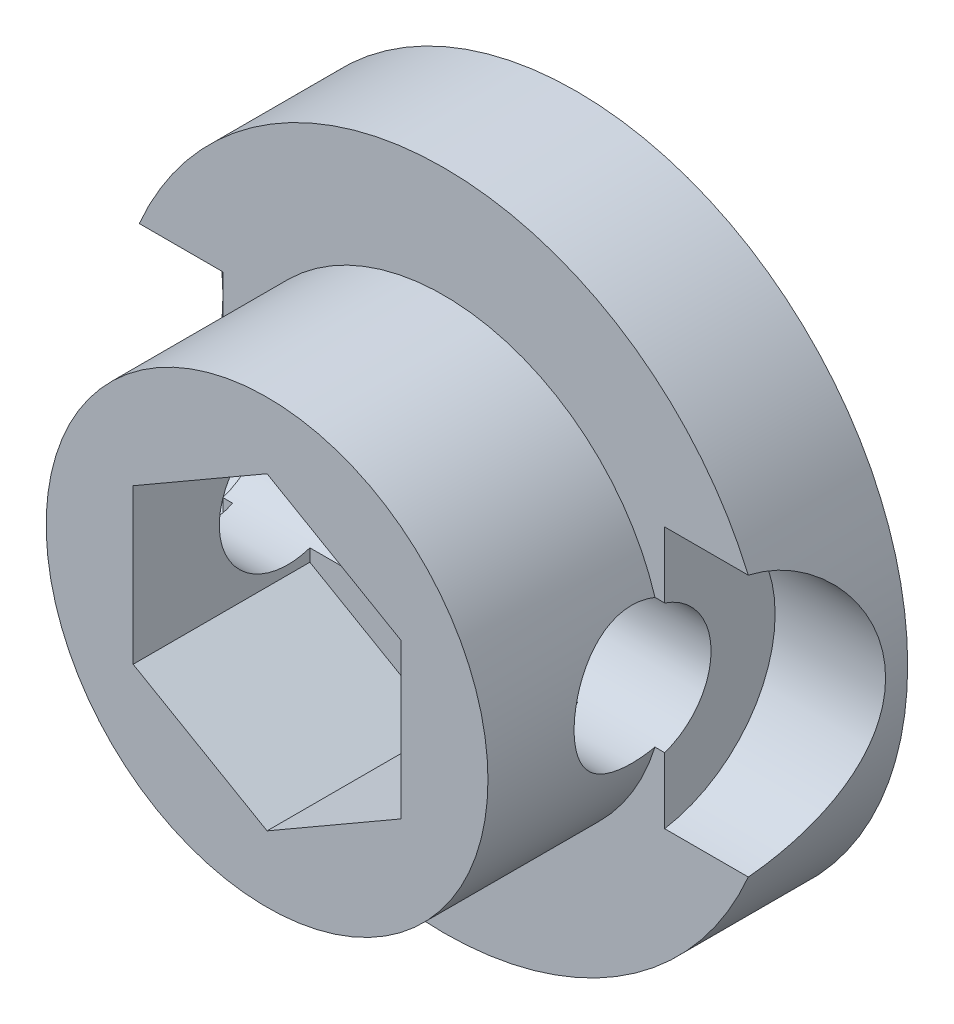
ISO-10303-21;
HEADER;
FILE_DESCRIPTION(('STEP AP214'),'2;1');
FILE_NAME('part.step','',(''),(''),'','','');
FILE_SCHEMA(('AUTOMOTIVE_DESIGN { 1 0 10303 214 1 1 1 1 }'));
ENDSEC;
DATA;
#1=APPLICATION_CONTEXT('core data for automotive mechanical design processes');
#2=APPLICATION_PROTOCOL_DEFINITION('international standard','automotive_design',2000,#1);
#3=PRODUCT_CONTEXT('',#1,'mechanical');
#4=PRODUCT('Part','Part','',(#3));
#5=PRODUCT_RELATED_PRODUCT_CATEGORY('part','',(#4));
#6=PRODUCT_DEFINITION_FORMATION('','',#4);
#7=PRODUCT_DEFINITION_CONTEXT('part definition',#1,'design');
#8=PRODUCT_DEFINITION('design','',#6,#7);
#9=PRODUCT_DEFINITION_SHAPE('','',#8);
#10=(LENGTH_UNIT() NAMED_UNIT(*) SI_UNIT(.MILLI.,.METRE.));
#11=(NAMED_UNIT(*) PLANE_ANGLE_UNIT() SI_UNIT($,.RADIAN.));
#12=(NAMED_UNIT(*) SI_UNIT($,.STERADIAN.) SOLID_ANGLE_UNIT());
#13=UNCERTAINTY_MEASURE_WITH_UNIT(LENGTH_MEASURE(1.E-05),#10,'distance_accuracy_value','');
#14=(GEOMETRIC_REPRESENTATION_CONTEXT(3) GLOBAL_UNCERTAINTY_ASSIGNED_CONTEXT((#13)) GLOBAL_UNIT_ASSIGNED_CONTEXT((#10,
#11,#12)) REPRESENTATION_CONTEXT('',''));
#15=CARTESIAN_POINT('',(0.,0.,0.));
#16=DIRECTION('',(0.,0.,1.));
#17=DIRECTION('',(1.,0.,0.));
#18=AXIS2_PLACEMENT_3D('',#15,#16,#17);
#19=CARTESIAN_POINT('',(0.,0.,3.));
#20=DIRECTION('',(0.,0.,1.));
#21=DIRECTION('',(1.,0.,0.));
#22=AXIS2_PLACEMENT_3D('',#19,#20,#21);
#23=PLANE('',#22);
#24=DIRECTION('',(-1.,0.,0.));
#25=VECTOR('',#24,1.);
#26=CARTESIAN_POINT('',(7.5,2.95803989154981,3.));
#27=LINE('',#26,#25);
#28=CARTESIAN_POINT('',(6.89202437604511,2.95803989154981,3.));
#29=VERTEX_POINT('',#28);
#30=CARTESIAN_POINT('',(5.,2.95803989154981,3.));
#31=VERTEX_POINT('',#30);
#32=EDGE_CURVE('E157',#29,#31,#27,.T.);
#33=ORIENTED_EDGE('',*,*,#32,.F.);
#34=CARTESIAN_POINT('',(0.,0.,3.));
#35=DIRECTION('',(0.,0.,1.));
#36=DIRECTION('',(1.,0.,0.));
#37=AXIS2_PLACEMENT_3D('',#34,#35,#36);
#38=CIRCLE('',#37,7.5);
#39=CARTESIAN_POINT('',(-6.89202437604511,2.95803989154981,3.));
#40=VERTEX_POINT('',#39);
#41=EDGE_CURVE('E238',#29,#40,#38,.T.);
#42=ORIENTED_EDGE('',*,*,#41,.T.);
#43=DIRECTION('',(1.,0.,0.));
#44=VECTOR('',#43,1.);
#45=CARTESIAN_POINT('',(-7.5,2.95803989154981,3.));
#46=LINE('',#45,#44);
#47=CARTESIAN_POINT('',(-5.,2.95803989154981,3.));
#48=VERTEX_POINT('',#47);
#49=EDGE_CURVE('E319',#40,#48,#46,.T.);
#50=ORIENTED_EDGE('',*,*,#49,.T.);
#51=DIRECTION('',(0.,-1.,0.));
#52=VECTOR('',#51,1.);
#53=CARTESIAN_POINT('',(-5.,0.,3.));
#54=LINE('',#53,#52);
#55=CARTESIAN_POINT('',(-5.,1.46714007511212,3.));
#56=VERTEX_POINT('',#55);
#57=EDGE_CURVE('E317',#48,#56,#54,.T.);
#58=ORIENTED_EDGE('',*,*,#57,.T.);
#59=DIRECTION('',(1.,0.,0.));
#60=VECTOR('',#59,1.);
#61=CARTESIAN_POINT('',(-5.,1.46714007511212,3.));
#62=LINE('',#61,#60);
#63=CARTESIAN_POINT('',(-4.7799058568135,1.46714007511212,3.));
#64=VERTEX_POINT('',#63);
#65=EDGE_CURVE('E296',#56,#64,#62,.T.);
#66=ORIENTED_EDGE('',*,*,#65,.T.);
#67=CARTESIAN_POINT('',(0.,0.,3.));
#68=DIRECTION('',(0.,0.,1.));
#69=DIRECTION('',(1.,0.,0.));
#70=AXIS2_PLACEMENT_3D('',#67,#68,#69);
#71=CIRCLE('',#70,5.);
#72=CARTESIAN_POINT('',(4.7799058568135,1.46714007511212,3.));
#73=VERTEX_POINT('',#72);
#74=EDGE_CURVE('E258',#73,#64,#71,.T.);
#75=ORIENTED_EDGE('',*,*,#74,.F.);
#76=CARTESIAN_POINT('',(5.,1.46714007511212,3.));
#77=VERTEX_POINT('',#76);
#78=EDGE_CURVE('E180',#73,#77,#62,.T.);
#79=ORIENTED_EDGE('',*,*,#78,.T.);
#80=DIRECTION('',(0.,-1.,0.));
#81=VECTOR('',#80,1.);
#82=CARTESIAN_POINT('',(5.,0.,3.));
#83=LINE('',#82,#81);
#84=EDGE_CURVE('E172',#31,#77,#83,.T.);
#85=ORIENTED_EDGE('',*,*,#84,.F.);
#86=EDGE_LOOP('',(#33,#42,#50,#58,#66,#75,#79,#85));
#87=FACE_BOUND('',#86,.T.);
#88=ADVANCED_FACE('F36',(#87),#23,.T.);
#89=DIRECTION('',(-1.,0.,0.));
#90=VECTOR('',#89,1.);
#91=CARTESIAN_POINT('',(7.5,-2.95803989154981,3.));
#92=LINE('',#91,#90);
#93=CARTESIAN_POINT('',(5.,-2.95803989154981,3.));
#94=VERTEX_POINT('',#93);
#95=CARTESIAN_POINT('',(6.89202437604511,-2.95803989154981,3.));
#96=VERTEX_POINT('',#95);
#97=EDGE_CURVE('E168',#94,#96,#92,.F.);
#98=ORIENTED_EDGE('',*,*,#97,.F.);
#99=CARTESIAN_POINT('',(5.,-1.46714007511212,3.));
#100=VERTEX_POINT('',#99);
#101=EDGE_CURVE('E175',#100,#94,#83,.T.);
#102=ORIENTED_EDGE('',*,*,#101,.F.);
#103=DIRECTION('',(1.,0.,0.));
#104=VECTOR('',#103,1.);
#105=CARTESIAN_POINT('',(-5.,-1.46714007511212,3.));
#106=LINE('',#105,#104);
#107=CARTESIAN_POINT('',(4.7799058568135,-1.46714007511212,3.));
#108=VERTEX_POINT('',#107);
#109=EDGE_CURVE('E295',#100,#108,#106,.F.);
#110=ORIENTED_EDGE('',*,*,#109,.T.);
#111=CARTESIAN_POINT('',(-4.7799058568135,-1.46714007511212,3.));
#112=VERTEX_POINT('',#111);
#113=EDGE_CURVE('E255',#112,#108,#71,.T.);
#114=ORIENTED_EDGE('',*,*,#113,.F.);
#115=CARTESIAN_POINT('',(-5.,-1.46714007511212,3.));
#116=VERTEX_POINT('',#115);
#117=EDGE_CURVE('E51',#112,#116,#106,.F.);
#118=ORIENTED_EDGE('',*,*,#117,.T.);
#119=CARTESIAN_POINT('',(-5.,-2.95803989154981,3.));
#120=VERTEX_POINT('',#119);
#121=EDGE_CURVE('E306',#116,#120,#54,.T.);
#122=ORIENTED_EDGE('',*,*,#121,.T.);
#123=DIRECTION('',(1.,0.,0.));
#124=VECTOR('',#123,1.);
#125=CARTESIAN_POINT('',(-7.5,-2.95803989154981,3.));
#126=LINE('',#125,#124);
#127=CARTESIAN_POINT('',(-6.89202437604511,-2.95803989154981,3.));
#128=VERTEX_POINT('',#127);
#129=EDGE_CURVE('E323',#120,#128,#126,.F.);
#130=ORIENTED_EDGE('',*,*,#129,.T.);
#131=EDGE_CURVE('E234',#128,#96,#38,.T.);
#132=ORIENTED_EDGE('',*,*,#131,.T.);
#133=EDGE_LOOP('',(#98,#102,#110,#114,#118,#122,#130,#132));
#134=FACE_BOUND('',#133,.T.);
#135=ADVANCED_FACE('F304',(#134),#23,.T.);
#136=CARTESIAN_POINT('',(0.,0.,3.));
#137=DIRECTION('',(0.,0.,-1.));
#138=DIRECTION('',(-1.,0.,0.));
#139=AXIS2_PLACEMENT_3D('',#136,#137,#138);
#140=CYLINDRICAL_SURFACE('',#139,7.5);
#141=CARTESIAN_POINT('',(0.,0.,0.));
#142=DIRECTION('',(0.,0.,1.));
#143=DIRECTION('',(1.,0.,0.));
#144=AXIS2_PLACEMENT_3D('',#141,#142,#143);
#145=CIRCLE('',#144,7.5);
#146=CARTESIAN_POINT('',(7.5,0.,0.));
#147=VERTEX_POINT('',#146);
#148=EDGE_CURVE('E233',#147,#147,#145,.T.);
#149=ORIENTED_EDGE('',*,*,#148,.T.);
#150=EDGE_LOOP('',(#149));
#151=FACE_BOUND('',#150,.T.);
#152=ORIENTED_EDGE('',*,*,#41,.F.);
#153=CARTESIAN_POINT('',(6.89202437604511,2.95803989154981,3.));
#154=CARTESIAN_POINT('',(6.89798007705996,2.94414106092694,2.91771283796205));
#155=CARTESIAN_POINT('',(6.90537857525717,2.92680947013218,2.83612909025819));
#156=CARTESIAN_POINT('',(6.92273789590706,2.88552180453271,2.67497696721876));
#157=CARTESIAN_POINT('',(6.93269739847281,2.86156914161172,2.59540757686127));
#158=CARTESIAN_POINT('',(6.95482701725531,2.80735189170725,2.43905576109352));
#159=CARTESIAN_POINT('',(6.9669900068327,2.77710760798336,2.3622652816107));
#160=CARTESIAN_POINT('',(6.99315426912352,2.71054870397947,2.21170334936067));
#161=CARTESIAN_POINT('',(7.00715574867831,2.67423340054683,2.13793223751758));
#162=CARTESIAN_POINT('',(7.05124961378374,2.55672991475454,1.92205866294511));
#163=CARTESIAN_POINT('',(7.083490379219,2.4668468737065,1.7850034628221));
#164=CARTESIAN_POINT('',(7.15016723670057,2.26633290858968,1.52758426623054));
#165=CARTESIAN_POINT('',(7.18460530615126,2.15568311714679,1.40723562264842));
#166=CARTESIAN_POINT('',(7.25380952194647,1.91029899320405,1.18052587179265));
#167=CARTESIAN_POINT('',(7.28851150786391,1.77466100511956,1.0751182702899));
#168=CARTESIAN_POINT('',(7.35268781115017,1.48651708244907,0.888542038345356));
#169=CARTESIAN_POINT('',(7.38216330137969,1.33401494479514,0.807367966934436));
#170=CARTESIAN_POINT('',(7.43222733062254,1.01839582026901,0.673015170084221));
#171=CARTESIAN_POINT('',(7.45293851820279,0.855464784196128,0.619447626874125));
#172=CARTESIAN_POINT('',(7.48368817502876,0.521917913544129,0.540790653654478));
#173=CARTESIAN_POINT('',(7.49373208590192,0.351306043485906,0.515686703258184));
#174=CARTESIAN_POINT('',(7.50168898565017,0.019466714564313,0.49576959667521));
#175=CARTESIAN_POINT('',(7.50036379573991,-0.141630896364149,0.499054288101056));
#176=CARTESIAN_POINT('',(7.4875335368653,-0.460808767883437,0.531266788207645));
#177=CARTESIAN_POINT('',(7.476029281008,-0.618889268451663,0.560192548671894));
#178=CARTESIAN_POINT('',(7.44434435827831,-0.924631939895197,0.641743065162085));
#179=CARTESIAN_POINT('',(7.42433074302191,-1.07243403902517,0.693912412950642));
#180=CARTESIAN_POINT('',(7.37758154241052,-1.35725579898227,0.820050101165612));
#181=CARTESIAN_POINT('',(7.35084470446168,-1.4942734443207,0.894022504130167));
#182=CARTESIAN_POINT('',(7.29156872154274,-1.76145672800861,1.06610771158473));
#183=CARTESIAN_POINT('',(7.25879878700925,-1.89088596008307,1.16528324563198));
#184=CARTESIAN_POINT('',(7.19171214564766,-2.13189092471089,1.38305794449804));
#185=CARTESIAN_POINT('',(7.15739432467236,-2.2434535255462,1.50167126744113));
#186=CARTESIAN_POINT('',(7.08877229603647,-2.45194577896208,1.76291559238993));
#187=CARTESIAN_POINT('',(7.05457929769657,-2.54768631747819,1.90652736393494));
#188=CARTESIAN_POINT('',(6.99249710255803,-2.71345846634827,2.20896992107735));
#189=CARTESIAN_POINT('',(6.96459648510756,-2.78353680014809,2.3677723769661));
#190=CARTESIAN_POINT('',(6.93109072156607,-2.86544154639955,2.60796405524978));
#191=CARTESIAN_POINT('',(6.92155508433189,-2.88834857466609,2.68517297311442));
#192=CARTESIAN_POINT('',(6.90490897624925,-2.92791239077809,2.84135887471556));
#193=CARTESIAN_POINT('',(6.89779644107866,-2.94457450009817,2.92033429206857));
#194=CARTESIAN_POINT('',(6.89202437604511,-2.95803989154981,3.));
#195=B_SPLINE_CURVE_WITH_KNOTS('',3,(#153,#154,#155,#156,#157,#158,#159,#160,#161,#162,#163,
#164,#165,#166,#167,#168,#169,#170,#171,#172,#173,#174,#175,#176,#177,#178,#179,#180,#181,#182,
#183,#184,#185,#186,#187,#188,#189,#190,#191,#192,#193,#194),.UNSPECIFIED.,.F.,.F.,(4,2,2,2,2,2,
2,2,2,2,2,2,2,2,2,2,2,2,2,2,4),(0.,0.250881514475987,0.50163398822681,0.751589491071426,
1.00157313957316,1.50029597111795,1.99947412402414,2.52270696231952,3.04582223464357,
3.56135331267881,4.07662127974802,4.55764628428609,5.03863286786082,5.51058381975784,
5.98262276538342,6.47942199117602,6.97658469792307,7.50195045734855,8.02635486512242,
8.26939354668247,8.51222465459226),.UNSPECIFIED.);
#196=EDGE_CURVE('E163',#29,#96,#195,.T.);
#197=ORIENTED_EDGE('',*,*,#196,.T.);
#198=ORIENTED_EDGE('',*,*,#131,.F.);
#199=CARTESIAN_POINT('',(-6.89202437604511,2.95803989154981,3.));
#200=CARTESIAN_POINT('',(-6.89797989056455,2.94414150944542,2.91771542363094));
#201=CARTESIAN_POINT('',(-6.90537811137316,2.92681056386438,2.83613421215097));
#202=CARTESIAN_POINT('',(-6.92273672770068,2.88552459371089,2.67498700347073));
#203=CARTESIAN_POINT('',(-6.93269580387939,2.86157297959954,2.59541999168221));
#204=CARTESIAN_POINT('',(-6.95482514275163,2.80735655199656,2.43906785753805));
#205=CARTESIAN_POINT('',(-6.96698841883267,2.77711164258796,2.36227483951003));
#206=CARTESIAN_POINT('',(-6.99315339440091,2.71055093432994,2.21170796278113));
#207=CARTESIAN_POINT('',(-7.00715530063509,2.67423445262971,2.13793444483704));
#208=CARTESIAN_POINT('',(-7.05125150770293,2.55672515081869,1.92204936321097));
#209=CARTESIAN_POINT('',(-7.08349444748246,2.46683705732684,1.78498611361407));
#210=CARTESIAN_POINT('',(-7.15017191272506,2.26631642802761,1.52756786476148));
#211=CARTESIAN_POINT('',(-7.18460813258167,2.15566772223603,1.40722601747398));
#212=CARTESIAN_POINT('',(-7.2537987191697,1.910342928291,1.18056162369121));
#213=CARTESIAN_POINT('',(-7.28848914574377,1.77476904347365,1.07518815958647));
#214=CARTESIAN_POINT('',(-7.3526732354459,1.48657486591587,0.888579531643271));
#215=CARTESIAN_POINT('',(-7.38216508178469,1.33394864408478,0.807352799774875));
#216=CARTESIAN_POINT('',(-7.41982949120782,1.09658283383378,0.706291382344055));
#217=CARTESIAN_POINT('',(-7.43123733816844,1.01658360269803,0.676192459580326));
#218=CARTESIAN_POINT('',(-7.45166408056873,0.854043398823617,0.622864229529928));
#219=CARTESIAN_POINT('',(-7.46068408524692,0.771503626219629,0.599631731955999));
#220=CARTESIAN_POINT('',(-7.47605015585836,0.604712295452115,0.560331473678701));
#221=CARTESIAN_POINT('',(-7.48240264926547,0.520465370715304,0.544246485256553));
#222=CARTESIAN_POINT('',(-7.49227362300946,0.350781180361864,0.519346397842573));
#223=CARTESIAN_POINT('',(-7.49579413128329,0.265344811165871,0.510526096622089));
#224=CARTESIAN_POINT('',(-7.49856413356893,0.149775012261815,0.503591157652402));
#225=CARTESIAN_POINT('',(-7.49910210995924,0.119838963951856,0.5022450684138));
#226=CARTESIAN_POINT('',(-7.49982052031981,0.0599384843827326,0.50044886393518));
#227=CARTESIAN_POINT('',(-7.50000095298906,0.0299740530206845,0.499998751955425));
#228=CARTESIAN_POINT('',(-7.49999487319514,-0.16125171606602,0.500006714118017));
#229=CARTESIAN_POINT('',(-7.49474021310853,-0.322781895257034,0.513076365471474));
#230=CARTESIAN_POINT('',(-7.47424809748624,-0.641266622346515,0.564879144257711));
#231=CARTESIAN_POINT('',(-7.45898490941743,-0.798208283442106,0.603678427051654));
#232=CARTESIAN_POINT('',(-7.42011333778302,-1.10243255544539,0.705314215517417));
#233=CARTESIAN_POINT('',(-7.39653161475753,-1.24974426272786,0.768073981159239));
#234=CARTESIAN_POINT('',(-7.34334847799561,-1.53161059193471,0.915530138532134));
#235=CARTESIAN_POINT('',(-7.31374928066871,-1.66616988426335,1.00021845647818));
#236=CARTESIAN_POINT('',(-7.24996964805981,-1.92522576672138,1.19333564629116));
#237=CARTESIAN_POINT('',(-7.21564748392705,-2.04904652043039,1.30262445500462));
#238=CARTESIAN_POINT('',(-7.14692317472834,-2.27721793797945,1.54004035088735));
#239=CARTESIAN_POINT('',(-7.11252098571266,-2.38155122384846,1.66818407164561));
#240=CARTESIAN_POINT('',(-7.04580317801676,-2.5724249427648,1.94682404801862));
#241=CARTESIAN_POINT('',(-7.01365316041384,-2.65794272963621,2.09807090658876));
#242=CARTESIAN_POINT('',(-6.97147449999149,-2.76586764192242,2.33487412377784));
#243=CARTESIAN_POINT('',(-6.95842874136038,-2.79843709038167,2.41541230226543));
#244=CARTESIAN_POINT('',(-6.9347753477954,-2.85655010096218,2.57931467640798));
#245=CARTESIAN_POINT('',(-6.92416605065977,-2.88209845536535,2.66267690062422));
#246=CARTESIAN_POINT('',(-6.91043203824996,-2.91480101161575,2.78880805582179));
#247=CARTESIAN_POINT('',(-6.90623707126573,-2.92472001470984,2.83076559499722));
#248=CARTESIAN_POINT('',(-6.89857689408374,-2.94274207782305,2.9150858501908));
#249=CARTESIAN_POINT('',(-6.89511088291808,-2.95084713162281,2.95744806745858));
#250=CARTESIAN_POINT('',(-6.89202437604511,-2.95803989154981,3.));
#251=B_SPLINE_CURVE_WITH_KNOTS('',3,(#199,#200,#201,#202,#203,#204,#205,#206,#207,#208,#209,
#210,#211,#212,#213,#214,#215,#216,#217,#218,#219,#220,#221,#222,#223,#224,#225,#226,#227,#228,
#229,#230,#231,#232,#233,#234,#235,#236,#237,#238,#239,#240,#241,#242,#243,#244,#245,#246,#247,
#248,#249,#250),.UNSPECIFIED.,.F.,.F.,(4,2,2,2,2,2,2,2,2,2,2,2,2,2,2,2,2,2,2,2,2,2,2,2,2,4),(0.,
0.25087364770624,0.501618304591835,0.751581656777907,1.00157314049809,1.50032858439603,
1.99947412280709,2.5225569439118,3.04582221006185,3.30423556948686,3.56252867513561,
3.82019579163436,4.07767823238285,4.16757838931014,4.25747887336349,4.74111741629812,
5.22600432466806,5.7093511035717,6.1925201734045,6.6963389044715,7.20060479354825,
7.72776071170357,7.99102036546486,8.25409988123858,8.38401388837045,8.51378439303186),.UNSPECIFIED.);
#252=EDGE_CURVE('E11',#40,#128,#251,.T.);
#253=ORIENTED_EDGE('',*,*,#252,.F.);
#254=EDGE_LOOP('',(#152,#197,#198,#253));
#255=FACE_BOUND('',#254,.T.);
#256=ADVANCED_FACE('F189',(#151,#255),#140,.T.);
#257=CARTESIAN_POINT('',(0.,0.,7.));
#258=DIRECTION('',(0.,0.,-1.));
#259=DIRECTION('',(-1.,0.,0.));
#260=AXIS2_PLACEMENT_3D('',#257,#258,#259);
#261=CYLINDRICAL_SURFACE('',#260,5.);
#262=ORIENTED_EDGE('',*,*,#113,.T.);
#263=CARTESIAN_POINT('',(4.7799058568135,1.46714007511212,3.));
#264=CARTESIAN_POINT('',(4.77578513500434,1.48055808776733,3.03937258033688));
#265=CARTESIAN_POINT('',(4.77209165374891,1.49239832958257,3.07930945773034));
#266=CARTESIAN_POINT('',(4.76565060054895,1.5128425424997,3.16008072038677));
#267=CARTESIAN_POINT('',(4.7629031056154,1.52144625012674,3.20091517843234));
#268=CARTESIAN_POINT('',(4.75622737715009,1.54224833404673,3.32422929460703));
#269=CARTESIAN_POINT('',(4.75384717481677,1.54949675599777,3.40769311894183));
#270=CARTESIAN_POINT('',(4.75353458941771,1.55045356342131,3.57475565687602));
#271=CARTESIAN_POINT('',(4.75560698227671,1.54414741003677,3.65835441911058));
#272=CARTESIAN_POINT('',(4.76394753590231,1.51821797915938,3.82322446783383));
#273=CARTESIAN_POINT('',(4.77021477973212,1.49859761195778,3.90449625891893));
#274=CARTESIAN_POINT('',(4.7862009051255,1.44672397688593,4.06249946853974));
#275=CARTESIAN_POINT('',(4.79591894104197,1.41447380386221,4.13923199409289));
#276=CARTESIAN_POINT('',(4.81772819169217,1.3383045752284,4.28632445852564));
#277=CARTESIAN_POINT('',(4.8298205124777,1.29438007779218,4.35668140495435));
#278=CARTESIAN_POINT('',(4.85565390302998,1.1939103918851,4.49221633984429));
#279=CARTESIAN_POINT('',(4.86944328275486,1.13690701716731,4.55704569989479));
#280=CARTESIAN_POINT('',(4.89673696540585,1.01291236140935,4.6763993161641));
#281=CARTESIAN_POINT('',(4.91024124398136,0.945920231133616,4.73092269528246));
#282=CARTESIAN_POINT('',(4.9358386901459,0.801853371752742,4.82940768114296));
#283=CARTESIAN_POINT('',(4.94788976724977,0.724573767883992,4.87308155124227));
#284=CARTESIAN_POINT('',(4.96882777820124,0.563336605461597,4.94672107873659));
#285=CARTESIAN_POINT('',(4.97771532881978,0.479380352517436,4.97668940853117));
#286=CARTESIAN_POINT('',(4.99110233261518,0.309720842360739,5.02119748689455));
#287=CARTESIAN_POINT('',(4.99572034862801,0.224136785035324,5.03615515680031));
#288=CARTESIAN_POINT('',(5.00047854289942,0.0515581996072324,5.05156119632311));
#289=CARTESIAN_POINT('',(5.00061981058344,-0.0354359801836132,5.05201309594798));
#290=CARTESIAN_POINT('',(4.9964871897823,-0.205105801367998,5.03864196890736));
#291=CARTESIAN_POINT('',(4.99236882255185,-0.287825549758639,5.02532177406654));
#292=CARTESIAN_POINT('',(4.9803903977625,-0.449787854955486,4.98564592177194));
#293=CARTESIAN_POINT('',(4.97253011678184,-0.529030203824902,4.95928948594804));
#294=CARTESIAN_POINT('',(4.95378075461929,-0.682726034925833,4.89406775251883));
#295=CARTESIAN_POINT('',(4.94286246571063,-0.757124356344418,4.85508122961836));
#296=CARTESIAN_POINT('',(4.91913669473226,-0.898463926877895,4.76580172050015));
#297=CARTESIAN_POINT('',(4.90632877129049,-0.965403427366914,4.71550609131167));
#298=CARTESIAN_POINT('',(4.87956322243024,-1.09283005452009,4.60261523930374));
#299=CARTESIAN_POINT('',(4.86557999559465,-1.15294085213379,4.53960078953989));
#300=CARTESIAN_POINT('',(4.83847571593453,-1.26186819852721,4.40428635972815));
#301=CARTESIAN_POINT('',(4.82535479085196,-1.31068307661024,4.33198500857874));
#302=CARTESIAN_POINT('',(4.80131486661422,-1.39620293136365,4.17889863967603));
#303=CARTESIAN_POINT('',(4.79042730256178,-1.43273911287423,4.09801402001125));
#304=CARTESIAN_POINT('',(4.77244322882091,-1.49155690482403,3.93081677517247));
#305=CARTESIAN_POINT('',(4.76534564565167,-1.51384255196315,3.84450569474876));
#306=CARTESIAN_POINT('',(4.75606239264878,-1.54275510340858,3.67242926574252));
#307=CARTESIAN_POINT('',(4.75370059910991,-1.54994396490388,3.58676742770796));
#308=CARTESIAN_POINT('',(4.7536652246564,-1.55005524252293,3.41545477199398));
#309=CARTESIAN_POINT('',(4.75598783157823,-1.54298925923342,3.3298040020353));
#310=CARTESIAN_POINT('',(4.76272178413272,-1.52201347236508,3.20372469042074));
#311=CARTESIAN_POINT('',(4.76549012068352,-1.51334879002687,3.16226364685686));
#312=CARTESIAN_POINT('',(4.7719961213052,-1.49270446929339,3.08034357538153));
#313=CARTESIAN_POINT('',(4.77573177939912,-1.48073168764394,3.03988266145345));
#314=CARTESIAN_POINT('',(4.7799058568135,-1.46714007511212,3.));
#315=B_SPLINE_CURVE_WITH_KNOTS('',3,(#263,#264,#265,#266,#267,#268,#269,#270,#271,#272,#273,
#274,#275,#276,#277,#278,#279,#280,#281,#282,#283,#284,#285,#286,#287,#288,#289,#290,#291,#292,
#293,#294,#295,#296,#297,#298,#299,#300,#301,#302,#303,#304,#305,#306,#307,#308,#309,#310,#311,
#312,#313,#314),.UNSPECIFIED.,.F.,.F.,(4,2,2,2,2,2,2,2,2,2,2,2,2,2,2,2,2,2,2,2,2,2,2,2,2,4),(0.,
0.125328008816347,0.250666217938036,0.500797118934246,0.751196448261956,1.00154106160366,
1.25182436807627,1.50222454591548,1.763299027163,2.024395717412,2.29181511432105,
2.55918234572043,2.81887992766662,3.07851431121428,3.32899289711843,3.57948644044666,
3.83245925878039,4.08549125915252,4.3488818100537,4.61231129225771,4.87922667290445,
5.1460664118163,5.40278333197106,5.65929142027866,5.78650174600447,5.91345035381762),.UNSPECIFIED.);
#316=EDGE_CURVE('E212',#73,#108,#315,.T.);
#317=ORIENTED_EDGE('',*,*,#316,.F.);
#318=ORIENTED_EDGE('',*,*,#74,.T.);
#319=CARTESIAN_POINT('',(-4.7799058568135,-1.46714007511212,3.));
#320=CARTESIAN_POINT('',(-4.77578513500434,-1.48055808776733,3.03937258033688));
#321=CARTESIAN_POINT('',(-4.77209165374891,-1.49239832958257,3.07930945773034));
#322=CARTESIAN_POINT('',(-4.76565060054895,-1.5128425424997,3.16008072038677));
#323=CARTESIAN_POINT('',(-4.7629031056154,-1.52144625012674,3.20091517843234));
#324=CARTESIAN_POINT('',(-4.75622737715009,-1.54224833404673,3.32422929460703));
#325=CARTESIAN_POINT('',(-4.75384717481677,-1.54949675599777,3.40769311894183));
#326=CARTESIAN_POINT('',(-4.75353458941771,-1.55045356342131,3.57475565687602));
#327=CARTESIAN_POINT('',(-4.75560698227671,-1.54414741003677,3.65835441911058));
#328=CARTESIAN_POINT('',(-4.76394753590231,-1.51821797915938,3.82322446783383));
#329=CARTESIAN_POINT('',(-4.77021477973212,-1.49859761195778,3.90449625891893));
#330=CARTESIAN_POINT('',(-4.7862009051255,-1.44672397688593,4.06249946853974));
#331=CARTESIAN_POINT('',(-4.79591894104197,-1.41447380386221,4.13923199409289));
#332=CARTESIAN_POINT('',(-4.81772819169217,-1.3383045752284,4.28632445852564));
#333=CARTESIAN_POINT('',(-4.8298205124777,-1.29438007779218,4.35668140495435));
#334=CARTESIAN_POINT('',(-4.85565390302998,-1.1939103918851,4.49221633984429));
#335=CARTESIAN_POINT('',(-4.86944328275486,-1.13690701716731,4.55704569989479));
#336=CARTESIAN_POINT('',(-4.89673696540585,-1.01291236140935,4.6763993161641));
#337=CARTESIAN_POINT('',(-4.91024124398136,-0.945920231133615,4.73092269528246));
#338=CARTESIAN_POINT('',(-4.9358386901459,-0.801853371752742,4.82940768114296));
#339=CARTESIAN_POINT('',(-4.94788976724977,-0.724573767883992,4.87308155124227));
#340=CARTESIAN_POINT('',(-4.96882777820124,-0.563336605461596,4.94672107873659));
#341=CARTESIAN_POINT('',(-4.97771532881978,-0.479380352517436,4.97668940853117));
#342=CARTESIAN_POINT('',(-4.99110233261518,-0.309720842360738,5.02119748689455));
#343=CARTESIAN_POINT('',(-4.99572034862801,-0.224136785035324,5.03615515680031));
#344=CARTESIAN_POINT('',(-5.00047854289942,-0.0515581996072317,5.05156119632311));
#345=CARTESIAN_POINT('',(-5.00061981058344,0.0354359801836141,5.05201309594798));
#346=CARTESIAN_POINT('',(-4.9964871897823,0.205105801367999,5.03864196890736));
#347=CARTESIAN_POINT('',(-4.99236882255185,0.287825549758639,5.02532177406654));
#348=CARTESIAN_POINT('',(-4.9803903977625,0.449787854955487,4.98564592177194));
#349=CARTESIAN_POINT('',(-4.97253011678184,0.529030203824903,4.95928948594804));
#350=CARTESIAN_POINT('',(-4.95378075461929,0.682726034925833,4.89406775251883));
#351=CARTESIAN_POINT('',(-4.94286246571063,0.757124356344419,4.85508122961836));
#352=CARTESIAN_POINT('',(-4.91913669473226,0.898463926877896,4.76580172050015));
#353=CARTESIAN_POINT('',(-4.90632877129049,0.965403427366914,4.71550609131167));
#354=CARTESIAN_POINT('',(-4.87956322243024,1.0928300545201,4.60261523930374));
#355=CARTESIAN_POINT('',(-4.86557999559465,1.15294085213379,4.53960078953989));
#356=CARTESIAN_POINT('',(-4.83847571593453,1.26186819852721,4.40428635972815));
#357=CARTESIAN_POINT('',(-4.82535479085196,1.31068307661024,4.33198500857874));
#358=CARTESIAN_POINT('',(-4.80131486661422,1.39620293136365,4.17889863967602));
#359=CARTESIAN_POINT('',(-4.79042730256178,1.43273911287423,4.09801402001125));
#360=CARTESIAN_POINT('',(-4.77244322882091,1.49155690482403,3.93081677517246));
#361=CARTESIAN_POINT('',(-4.76534564565166,1.51384255196315,3.84450569474876));
#362=CARTESIAN_POINT('',(-4.75606239264878,1.54275510340858,3.67242926574252));
#363=CARTESIAN_POINT('',(-4.75370059910991,1.54994396490388,3.58676742770796));
#364=CARTESIAN_POINT('',(-4.7536652246564,1.55005524252293,3.41545477199397));
#365=CARTESIAN_POINT('',(-4.75598783157823,1.54298925923342,3.3298040020353));
#366=CARTESIAN_POINT('',(-4.76272178413272,1.52201347236508,3.20372469042074));
#367=CARTESIAN_POINT('',(-4.76549012068352,1.51334879002687,3.16226364685686));
#368=CARTESIAN_POINT('',(-4.7719961213052,1.49270446929339,3.08034357538153));
#369=CARTESIAN_POINT('',(-4.77573177939912,1.48073168764394,3.03988266145345));
#370=CARTESIAN_POINT('',(-4.7799058568135,1.46714007511212,3.));
#371=B_SPLINE_CURVE_WITH_KNOTS('',3,(#319,#320,#321,#322,#323,#324,#325,#326,#327,#328,#329,
#330,#331,#332,#333,#334,#335,#336,#337,#338,#339,#340,#341,#342,#343,#344,#345,#346,#347,#348,
#349,#350,#351,#352,#353,#354,#355,#356,#357,#358,#359,#360,#361,#362,#363,#364,#365,#366,#367,
#368,#369,#370),.UNSPECIFIED.,.F.,.F.,(4,2,2,2,2,2,2,2,2,2,2,2,2,2,2,2,2,2,2,2,2,2,2,2,2,4),(0.,
0.125328008816347,0.250666217938036,0.500797118934247,0.751196448261956,1.00154106160366,
1.25182436807627,1.50222454591548,1.76329902716301,2.024395717412,2.29181511432105,
2.55918234572043,2.81887992766662,3.07851431121428,3.32899289711843,3.57948644044666,
3.83245925878039,4.08549125915252,4.34888181005371,4.61231129225771,4.87922667290445,
5.1460664118163,5.40278333197106,5.65929142027866,5.78650174600447,5.91345035381762),.UNSPECIFIED.);
#372=EDGE_CURVE('E219',#112,#64,#371,.T.);
#373=ORIENTED_EDGE('',*,*,#372,.F.);
#374=EDGE_LOOP('',(#262,#317,#318,#373));
#375=FACE_BOUND('',#374,.T.);
#376=CARTESIAN_POINT('',(0.,0.,7.));
#377=DIRECTION('',(0.,0.,1.));
#378=DIRECTION('',(1.,0.,0.));
#379=AXIS2_PLACEMENT_3D('',#376,#377,#378);
#380=CIRCLE('',#379,5.);
#381=CARTESIAN_POINT('',(5.,0.,7.));
#382=VERTEX_POINT('',#381);
#383=EDGE_CURVE('E289',#382,#382,#380,.T.);
#384=ORIENTED_EDGE('',*,*,#383,.F.);
#385=EDGE_LOOP('',(#384));
#386=FACE_BOUND('',#385,.T.);
#387=ADVANCED_FACE('F38',(#375,#386),#261,.T.);
#388=DIRECTION('',(0.,1.,0.));
#389=VECTOR('',#388,1.);
#390=CARTESIAN_POINT('',(3.03108891324553,1.75000000000001,3.));
#391=LINE('',#390,#389);
#392=CARTESIAN_POINT('',(3.03108891324552,-1.75000000000002,3.));
#393=VERTEX_POINT('',#392);
#394=CARTESIAN_POINT('',(3.03108891324552,-1.46714007511212,3.));
#395=VERTEX_POINT('',#394);
#396=EDGE_CURVE('E244',#393,#395,#391,.T.);
#397=ORIENTED_EDGE('',*,*,#396,.T.);
#398=DIRECTION('',(1.,0.,0.));
#399=VECTOR('',#398,1.);
#400=CARTESIAN_POINT('',(-5.,-1.46714007511212,3.));
#401=LINE('',#400,#399);
#402=CARTESIAN_POINT('',(-3.03108891324553,-1.46714007511212,3.));
#403=VERTEX_POINT('',#402);
#404=EDGE_CURVE('E231',#395,#403,#401,.F.);
#405=ORIENTED_EDGE('',*,*,#404,.T.);
#406=DIRECTION('',(0.,-1.,0.));
#407=VECTOR('',#406,1.);
#408=CARTESIAN_POINT('',(-3.03108891324553,-1.75000000000001,3.));
#409=LINE('',#408,#407);
#410=CARTESIAN_POINT('',(-3.03108891324553,-1.75000000000001,3.));
#411=VERTEX_POINT('',#410);
#412=EDGE_CURVE('E66',#403,#411,#409,.T.);
#413=ORIENTED_EDGE('',*,*,#412,.T.);
#414=DIRECTION('',(0.866025403784439,-0.499999999999999,0.));
#415=VECTOR('',#414,1.);
#416=CARTESIAN_POINT('',(0.,-3.5,3.));
#417=LINE('',#416,#415);
#418=CARTESIAN_POINT('',(0.,-3.5,3.));
#419=VERTEX_POINT('',#418);
#420=EDGE_CURVE('E250',#411,#419,#417,.T.);
#421=ORIENTED_EDGE('',*,*,#420,.T.);
#422=DIRECTION('',(0.86602540378444,0.499999999999997,0.));
#423=VECTOR('',#422,1.);
#424=CARTESIAN_POINT('',(3.03108891324552,-1.75000000000002,3.));
#425=LINE('',#424,#423);
#426=EDGE_CURVE('E247',#419,#393,#425,.T.);
#427=ORIENTED_EDGE('',*,*,#426,.T.);
#428=EDGE_LOOP('',(#397,#405,#413,#421,#427));
#429=FACE_BOUND('',#428,.T.);
#430=ADVANCED_FACE('F209',(#429),#23,.T.);
#431=CARTESIAN_POINT('',(-3.03108891324552,1.75000000000003,3.));
#432=VERTEX_POINT('',#431);
#433=CARTESIAN_POINT('',(-3.03108891324553,1.46714007511212,3.));
#434=VERTEX_POINT('',#433);
#435=EDGE_CURVE('E252',#432,#434,#409,.T.);
#436=ORIENTED_EDGE('',*,*,#435,.T.);
#437=DIRECTION('',(1.,0.,0.));
#438=VECTOR('',#437,1.);
#439=CARTESIAN_POINT('',(-5.,1.46714007511212,3.));
#440=LINE('',#439,#438);
#441=CARTESIAN_POINT('',(3.03108891324553,1.46714007511212,3.));
#442=VERTEX_POINT('',#441);
#443=EDGE_CURVE('E225',#434,#442,#440,.T.);
#444=ORIENTED_EDGE('',*,*,#443,.T.);
#445=CARTESIAN_POINT('',(3.03108891324553,1.75000000000001,3.));
#446=VERTEX_POINT('',#445);
#447=EDGE_CURVE('E243',#442,#446,#391,.T.);
#448=ORIENTED_EDGE('',*,*,#447,.T.);
#449=DIRECTION('',(-0.866025403784439,0.499999999999999,0.));
#450=VECTOR('',#449,1.);
#451=CARTESIAN_POINT('',(0.,3.5,3.));
#452=LINE('',#451,#450);
#453=CARTESIAN_POINT('',(0.,3.5,3.));
#454=VERTEX_POINT('',#453);
#455=EDGE_CURVE('E237',#446,#454,#452,.T.);
#456=ORIENTED_EDGE('',*,*,#455,.T.);
#457=DIRECTION('',(-0.866025403784441,-0.499999999999996,0.));
#458=VECTOR('',#457,1.);
#459=CARTESIAN_POINT('',(-3.03108891324552,1.75000000000003,3.));
#460=LINE('',#459,#458);
#461=EDGE_CURVE('E292',#454,#432,#460,.T.);
#462=ORIENTED_EDGE('',*,*,#461,.T.);
#463=EDGE_LOOP('',(#436,#444,#448,#456,#462));
#464=FACE_BOUND('',#463,.T.);
#465=ADVANCED_FACE('F339',(#464),#23,.T.);
#466=CARTESIAN_POINT('',(0.,0.,7.));
#467=DIRECTION('',(0.,0.,1.));
#468=DIRECTION('',(1.,0.,0.));
#469=AXIS2_PLACEMENT_3D('',#466,#467,#468);
#470=PLANE('',#469);
#471=ORIENTED_EDGE('',*,*,#383,.T.);
#472=EDGE_LOOP('',(#471));
#473=FACE_BOUND('',#472,.T.);
#474=DIRECTION('',(0.866025403784439,-0.499999999999999,0.));
#475=VECTOR('',#474,1.);
#476=CARTESIAN_POINT('',(0.,-3.5,7.));
#477=LINE('',#476,#475);
#478=CARTESIAN_POINT('',(-3.03108891324553,-1.75000000000001,7.));
#479=VERTEX_POINT('',#478);
#480=CARTESIAN_POINT('',(0.,-3.5,7.));
#481=VERTEX_POINT('',#480);
#482=EDGE_CURVE('E261',#479,#481,#477,.T.);
#483=ORIENTED_EDGE('',*,*,#482,.F.);
#484=DIRECTION('',(0.,-1.,0.));
#485=VECTOR('',#484,1.);
#486=CARTESIAN_POINT('',(-3.03108891324553,-1.75000000000001,7.));
#487=LINE('',#486,#485);
#488=CARTESIAN_POINT('',(-3.03108891324552,1.75000000000003,7.));
#489=VERTEX_POINT('',#488);
#490=EDGE_CURVE('E259',#489,#479,#487,.T.);
#491=ORIENTED_EDGE('',*,*,#490,.F.);
#492=DIRECTION('',(-0.866025403784441,-0.499999999999996,0.));
#493=VECTOR('',#492,1.);
#494=CARTESIAN_POINT('',(-3.03108891324552,1.75000000000003,7.));
#495=LINE('',#494,#493);
#496=CARTESIAN_POINT('',(0.,3.5,7.));
#497=VERTEX_POINT('',#496);
#498=EDGE_CURVE('E270',#497,#489,#495,.T.);
#499=ORIENTED_EDGE('',*,*,#498,.F.);
#500=DIRECTION('',(-0.866025403784439,0.499999999999999,0.));
#501=VECTOR('',#500,1.);
#502=CARTESIAN_POINT('',(0.,3.5,7.));
#503=LINE('',#502,#501);
#504=CARTESIAN_POINT('',(3.03108891324553,1.75000000000001,7.));
#505=VERTEX_POINT('',#504);
#506=EDGE_CURVE('E267',#505,#497,#503,.T.);
#507=ORIENTED_EDGE('',*,*,#506,.F.);
#508=DIRECTION('',(0.,1.,0.));
#509=VECTOR('',#508,1.);
#510=CARTESIAN_POINT('',(3.03108891324553,1.75000000000001,7.));
#511=LINE('',#510,#509);
#512=CARTESIAN_POINT('',(3.03108891324552,-1.75000000000002,7.));
#513=VERTEX_POINT('',#512);
#514=EDGE_CURVE('E265',#513,#505,#511,.T.);
#515=ORIENTED_EDGE('',*,*,#514,.F.);
#516=DIRECTION('',(0.866025403784441,0.499999999999997,0.));
#517=VECTOR('',#516,1.);
#518=CARTESIAN_POINT('',(3.03108891324552,-1.75000000000002,7.));
#519=LINE('',#518,#517);
#520=EDGE_CURVE('E263',#481,#513,#519,.T.);
#521=ORIENTED_EDGE('',*,*,#520,.F.);
#522=EDGE_LOOP('',(#483,#491,#499,#507,#515,#521));
#523=FACE_BOUND('',#522,.T.);
#524=ADVANCED_FACE('F347',(#473,#523),#470,.T.);
#525=CARTESIAN_POINT('',(-3.03108891324553,-1.75000000000001,7.));
#526=DIRECTION('',(1.,0.,0.));
#527=DIRECTION('',(0.,1.,0.));
#528=AXIS2_PLACEMENT_3D('',#525,#526,#527);
#529=PLANE('',#528);
#530=ORIENTED_EDGE('',*,*,#412,.F.);
#531=CARTESIAN_POINT('',(-3.03108891324553,0.,3.5));
#532=DIRECTION('',(1.,0.,0.));
#533=DIRECTION('',(0.,1.,0.));
#534=AXIS2_PLACEMENT_3D('',#531,#532,#533);
#535=CIRCLE('',#534,1.55);
#536=EDGE_CURVE('E228',#403,#434,#535,.F.);
#537=ORIENTED_EDGE('',*,*,#536,.T.);
#538=ORIENTED_EDGE('',*,*,#435,.F.);
#539=DIRECTION('',(0.,0.,-1.));
#540=VECTOR('',#539,1.);
#541=CARTESIAN_POINT('',(-3.03108891324552,1.75000000000003,7.));
#542=LINE('',#541,#540);
#543=EDGE_CURVE('E272',#489,#432,#542,.T.);
#544=ORIENTED_EDGE('',*,*,#543,.F.);
#545=ORIENTED_EDGE('',*,*,#490,.T.);
#546=DIRECTION('',(0.,0.,-1.));
#547=VECTOR('',#546,1.);
#548=CARTESIAN_POINT('',(-3.03108891324553,-1.75000000000001,7.));
#549=LINE('',#548,#547);
#550=EDGE_CURVE('E286',#479,#411,#549,.T.);
#551=ORIENTED_EDGE('',*,*,#550,.T.);
#552=EDGE_LOOP('',(#530,#537,#538,#544,#545,#551));
#553=FACE_BOUND('',#552,.T.);
#554=ADVANCED_FACE('F369',(#553),#529,.T.);
#555=CARTESIAN_POINT('',(0.,-3.5,7.));
#556=DIRECTION('',(0.499999999999999,0.866025403784439,0.));
#557=DIRECTION('',(-0.866025403784439,0.499999999999999,0.));
#558=AXIS2_PLACEMENT_3D('',#555,#556,#557);
#559=PLANE('',#558);
#560=ORIENTED_EDGE('',*,*,#420,.F.);
#561=ORIENTED_EDGE('',*,*,#550,.F.);
#562=ORIENTED_EDGE('',*,*,#482,.T.);
#563=DIRECTION('',(0.,0.,-1.));
#564=VECTOR('',#563,1.);
#565=CARTESIAN_POINT('',(0.,-3.5,7.));
#566=LINE('',#565,#564);
#567=EDGE_CURVE('E283',#481,#419,#566,.T.);
#568=ORIENTED_EDGE('',*,*,#567,.T.);
#569=EDGE_LOOP('',(#560,#561,#562,#568));
#570=FACE_BOUND('',#569,.T.);
#571=ADVANCED_FACE('F373',(#570),#559,.T.);
#572=CARTESIAN_POINT('',(3.03108891324552,-1.75000000000002,7.));
#573=DIRECTION('',(-0.499999999999997,0.86602540378444,0.));
#574=DIRECTION('',(-0.86602540378444,-0.499999999999997,0.));
#575=AXIS2_PLACEMENT_3D('',#572,#573,#574);
#576=PLANE('',#575);
#577=ORIENTED_EDGE('',*,*,#426,.F.);
#578=ORIENTED_EDGE('',*,*,#567,.F.);
#579=ORIENTED_EDGE('',*,*,#520,.T.);
#580=DIRECTION('',(0.,0.,-1.));
#581=VECTOR('',#580,1.);
#582=CARTESIAN_POINT('',(3.03108891324552,-1.75000000000002,7.));
#583=LINE('',#582,#581);
#584=EDGE_CURVE('E280',#513,#393,#583,.T.);
#585=ORIENTED_EDGE('',*,*,#584,.T.);
#586=EDGE_LOOP('',(#577,#578,#579,#585));
#587=FACE_BOUND('',#586,.T.);
#588=ADVANCED_FACE('F355',(#587),#576,.T.);
#589=CARTESIAN_POINT('',(3.03108891324553,1.75000000000001,7.));
#590=DIRECTION('',(-1.,0.,0.));
#591=DIRECTION('',(0.,-1.,0.));
#592=AXIS2_PLACEMENT_3D('',#589,#590,#591);
#593=PLANE('',#592);
#594=ORIENTED_EDGE('',*,*,#447,.F.);
#595=CARTESIAN_POINT('',(3.03108891324553,0.,3.5));
#596=DIRECTION('',(-1.,0.,0.));
#597=DIRECTION('',(0.,-1.,0.));
#598=AXIS2_PLACEMENT_3D('',#595,#596,#597);
#599=CIRCLE('',#598,1.55);
#600=EDGE_CURVE('E58',#442,#395,#599,.F.);
#601=ORIENTED_EDGE('',*,*,#600,.T.);
#602=ORIENTED_EDGE('',*,*,#396,.F.);
#603=ORIENTED_EDGE('',*,*,#584,.F.);
#604=ORIENTED_EDGE('',*,*,#514,.T.);
#605=DIRECTION('',(0.,0.,-1.));
#606=VECTOR('',#605,1.);
#607=CARTESIAN_POINT('',(3.03108891324553,1.75000000000001,7.));
#608=LINE('',#607,#606);
#609=EDGE_CURVE('E277',#505,#446,#608,.T.);
#610=ORIENTED_EDGE('',*,*,#609,.T.);
#611=EDGE_LOOP('',(#594,#601,#602,#603,#604,#610));
#612=FACE_BOUND('',#611,.T.);
#613=ADVANCED_FACE('F352',(#612),#593,.T.);
#614=CARTESIAN_POINT('',(0.,3.5,7.));
#615=DIRECTION('',(-0.499999999999999,-0.866025403784439,0.));
#616=DIRECTION('',(0.866025403784439,-0.499999999999999,0.));
#617=AXIS2_PLACEMENT_3D('',#614,#615,#616);
#618=PLANE('',#617);
#619=ORIENTED_EDGE('',*,*,#455,.F.);
#620=ORIENTED_EDGE('',*,*,#609,.F.);
#621=ORIENTED_EDGE('',*,*,#506,.T.);
#622=DIRECTION('',(0.,0.,-1.));
#623=VECTOR('',#622,1.);
#624=CARTESIAN_POINT('',(0.,3.5,7.));
#625=LINE('',#624,#623);
#626=EDGE_CURVE('E274',#497,#454,#625,.T.);
#627=ORIENTED_EDGE('',*,*,#626,.T.);
#628=EDGE_LOOP('',(#619,#620,#621,#627));
#629=FACE_BOUND('',#628,.T.);
#630=ADVANCED_FACE('F366',(#629),#618,.T.);
#631=CARTESIAN_POINT('',(-3.03108891324552,1.75000000000003,7.));
#632=DIRECTION('',(0.499999999999996,-0.866025403784441,0.));
#633=DIRECTION('',(0.866025403784441,0.499999999999996,0.));
#634=AXIS2_PLACEMENT_3D('',#631,#632,#633);
#635=PLANE('',#634);
#636=ORIENTED_EDGE('',*,*,#461,.F.);
#637=ORIENTED_EDGE('',*,*,#626,.F.);
#638=ORIENTED_EDGE('',*,*,#498,.T.);
#639=ORIENTED_EDGE('',*,*,#543,.T.);
#640=EDGE_LOOP('',(#636,#637,#638,#639));
#641=FACE_BOUND('',#640,.T.);
#642=ADVANCED_FACE('F387',(#641),#635,.T.);
#643=CARTESIAN_POINT('',(0.,0.,0.));
#644=DIRECTION('',(0.,0.,1.));
#645=DIRECTION('',(1.,0.,0.));
#646=AXIS2_PLACEMENT_3D('',#643,#644,#645);
#647=PLANE('',#646);
#648=ORIENTED_EDGE('',*,*,#148,.F.);
#649=EDGE_LOOP('',(#648));
#650=FACE_BOUND('',#649,.T.);
#651=ADVANCED_FACE('F208',(#650),#647,.F.);
#652=CARTESIAN_POINT('',(-5.,0.,3.5));
#653=DIRECTION('',(1.,0.,0.));
#654=DIRECTION('',(0.,0.,-1.));
#655=AXIS2_PLACEMENT_3D('',#652,#653,#654);
#656=CYLINDRICAL_SURFACE('',#655,1.55);
#657=ORIENTED_EDGE('',*,*,#600,.F.);
#658=ORIENTED_EDGE('',*,*,#443,.F.);
#659=ORIENTED_EDGE('',*,*,#536,.F.);
#660=ORIENTED_EDGE('',*,*,#404,.F.);
#661=EDGE_LOOP('',(#657,#658,#659,#660));
#662=FACE_BOUND('',#661,.T.);
#663=CARTESIAN_POINT('',(5.,0.,3.5));
#664=DIRECTION('',(-1.,0.,0.));
#665=DIRECTION('',(0.,0.,1.));
#666=AXIS2_PLACEMENT_3D('',#663,#664,#665);
#667=CIRCLE('',#666,1.55);
#668=EDGE_CURVE('E328',#77,#100,#667,.T.);
#669=ORIENTED_EDGE('',*,*,#668,.F.);
#670=ORIENTED_EDGE('',*,*,#78,.F.);
#671=ORIENTED_EDGE('',*,*,#316,.T.);
#672=ORIENTED_EDGE('',*,*,#109,.F.);
#673=EDGE_LOOP('',(#669,#670,#671,#672));
#674=FACE_BOUND('',#673,.T.);
#675=ORIENTED_EDGE('',*,*,#372,.T.);
#676=ORIENTED_EDGE('',*,*,#65,.F.);
#677=CARTESIAN_POINT('',(-5.,0.,3.5));
#678=DIRECTION('',(-1.,0.,0.));
#679=DIRECTION('',(0.,0.,1.));
#680=AXIS2_PLACEMENT_3D('',#677,#678,#679);
#681=CIRCLE('',#680,1.55);
#682=EDGE_CURVE('E311',#56,#116,#681,.T.);
#683=ORIENTED_EDGE('',*,*,#682,.T.);
#684=ORIENTED_EDGE('',*,*,#117,.F.);
#685=EDGE_LOOP('',(#675,#676,#683,#684));
#686=FACE_BOUND('',#685,.T.);
#687=ADVANCED_FACE('F200',(#662,#674,#686),#656,.F.);
#688=CARTESIAN_POINT('',(-5.,0.,3.5));
#689=DIRECTION('',(-1.,0.,0.));
#690=DIRECTION('',(0.,0.,1.));
#691=AXIS2_PLACEMENT_3D('',#688,#689,#690);
#692=PLANE('',#691);
#693=CARTESIAN_POINT('',(-5.,0.,3.5));
#694=DIRECTION('',(-1.,0.,0.));
#695=DIRECTION('',(0.,0.,1.));
#696=AXIS2_PLACEMENT_3D('',#693,#694,#695);
#697=CIRCLE('',#696,3.);
#698=EDGE_CURVE('E167',#48,#120,#697,.T.);
#699=ORIENTED_EDGE('',*,*,#698,.T.);
#700=ORIENTED_EDGE('',*,*,#121,.F.);
#701=ORIENTED_EDGE('',*,*,#682,.F.);
#702=ORIENTED_EDGE('',*,*,#57,.F.);
#703=EDGE_LOOP('',(#699,#700,#701,#702));
#704=FACE_BOUND('',#703,.T.);
#705=ADVANCED_FACE('F197',(#704),#692,.T.);
#706=CARTESIAN_POINT('',(-7.5,0.,3.5));
#707=DIRECTION('',(1.,0.,0.));
#708=DIRECTION('',(0.,0.,-1.));
#709=AXIS2_PLACEMENT_3D('',#706,#707,#708);
#710=CYLINDRICAL_SURFACE('',#709,3.);
#711=ORIENTED_EDGE('',*,*,#698,.F.);
#712=ORIENTED_EDGE('',*,*,#49,.F.);
#713=ORIENTED_EDGE('',*,*,#252,.T.);
#714=ORIENTED_EDGE('',*,*,#129,.F.);
#715=EDGE_LOOP('',(#711,#712,#713,#714));
#716=FACE_BOUND('',#715,.T.);
#717=ADVANCED_FACE('F199',(#716),#710,.F.);
#718=CARTESIAN_POINT('',(5.,0.,3.5));
#719=DIRECTION('',(-1.,0.,0.));
#720=DIRECTION('',(0.,0.,1.));
#721=AXIS2_PLACEMENT_3D('',#718,#719,#720);
#722=PLANE('',#721);
#723=ORIENTED_EDGE('',*,*,#84,.T.);
#724=ORIENTED_EDGE('',*,*,#668,.T.);
#725=ORIENTED_EDGE('',*,*,#101,.T.);
#726=CARTESIAN_POINT('',(5.,0.,3.5));
#727=DIRECTION('',(-1.,0.,0.));
#728=DIRECTION('',(0.,0.,1.));
#729=AXIS2_PLACEMENT_3D('',#726,#727,#728);
#730=CIRCLE('',#729,3.);
#731=EDGE_CURVE('E161',#31,#94,#730,.T.);
#732=ORIENTED_EDGE('',*,*,#731,.F.);
#733=EDGE_LOOP('',(#723,#724,#725,#732));
#734=FACE_BOUND('',#733,.T.);
#735=ADVANCED_FACE('F171',(#734),#722,.F.);
#736=CARTESIAN_POINT('',(7.5,0.,3.5));
#737=DIRECTION('',(-1.,0.,0.));
#738=DIRECTION('',(0.,0.,1.));
#739=AXIS2_PLACEMENT_3D('',#736,#737,#738);
#740=CYLINDRICAL_SURFACE('',#739,3.);
#741=ORIENTED_EDGE('',*,*,#32,.T.);
#742=ORIENTED_EDGE('',*,*,#731,.T.);
#743=ORIENTED_EDGE('',*,*,#97,.T.);
#744=ORIENTED_EDGE('',*,*,#196,.F.);
#745=EDGE_LOOP('',(#741,#742,#743,#744));
#746=FACE_BOUND('',#745,.T.);
#747=ADVANCED_FACE('F159',(#746),#740,.F.);
#748=CLOSED_SHELL('',(#88,#135,#256,#387,#430,#465,#524,#554,#571,#588,#613,#630,#642,#651,#687,
#705,#717,#735,#747));
#749=MANIFOLD_SOLID_BREP('B2',#748);
#750=ADVANCED_BREP_SHAPE_REPRESENTATION('',(#18,#749),#14);
#751=SHAPE_DEFINITION_REPRESENTATION(#9,#750);
ENDSEC;
END-ISO-10303-21;
